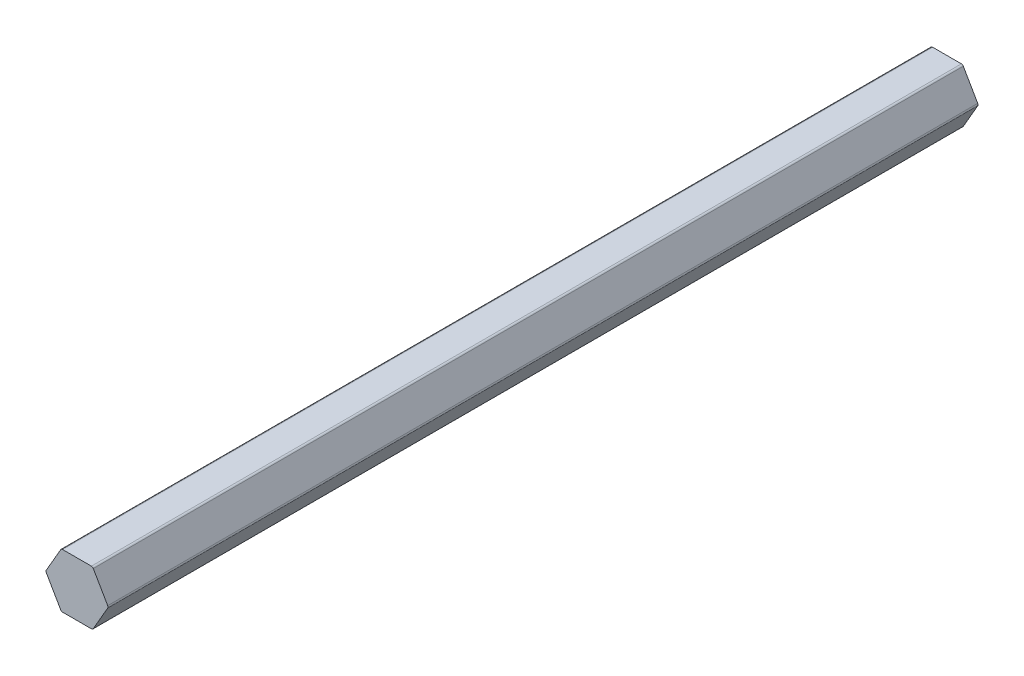
ISO-10303-21;
HEADER;
FILE_DESCRIPTION(('STEP AP214'),'2;1');
FILE_NAME('part.step','',(''),(''),'','','');
FILE_SCHEMA(('AUTOMOTIVE_DESIGN { 1 0 10303 214 1 1 1 1 }'));
ENDSEC;
DATA;
#1=APPLICATION_CONTEXT('core data for automotive mechanical design processes');
#2=APPLICATION_PROTOCOL_DEFINITION('international standard','automotive_design',2000,#1);
#3=PRODUCT_CONTEXT('',#1,'mechanical');
#4=PRODUCT('Part','Part','',(#3));
#5=PRODUCT_RELATED_PRODUCT_CATEGORY('part','',(#4));
#6=PRODUCT_DEFINITION_FORMATION('','',#4);
#7=PRODUCT_DEFINITION_CONTEXT('part definition',#1,'design');
#8=PRODUCT_DEFINITION('design','',#6,#7);
#9=PRODUCT_DEFINITION_SHAPE('','',#8);
#10=(LENGTH_UNIT() NAMED_UNIT(*) SI_UNIT(.MILLI.,.METRE.));
#11=(NAMED_UNIT(*) PLANE_ANGLE_UNIT() SI_UNIT($,.RADIAN.));
#12=(NAMED_UNIT(*) SI_UNIT($,.STERADIAN.) SOLID_ANGLE_UNIT());
#13=UNCERTAINTY_MEASURE_WITH_UNIT(LENGTH_MEASURE(1.E-05),#10,'distance_accuracy_value','');
#14=(GEOMETRIC_REPRESENTATION_CONTEXT(3) GLOBAL_UNCERTAINTY_ASSIGNED_CONTEXT((#13)) GLOBAL_UNIT_ASSIGNED_CONTEXT((#10,
#11,#12)) REPRESENTATION_CONTEXT('',''));
#15=CARTESIAN_POINT('',(0.,0.,0.));
#16=DIRECTION('',(0.,0.,1.));
#17=DIRECTION('',(1.,0.,0.));
#18=AXIS2_PLACEMENT_3D('',#15,#16,#17);
#19=CARTESIAN_POINT('',(-3.36554792418708,-5.8293,457.2));
#20=DIRECTION('',(0.,0.,-1.));
#21=DIRECTION('',(-1.,0.,0.));
#22=AXIS2_PLACEMENT_3D('',#19,#20,#21);
#23=CYLINDRICAL_SURFACE('',#22,0.508);
#24=CARTESIAN_POINT('',(-3.36554792418708,-5.8293,254.));
#25=DIRECTION('',(0.,0.,1.));
#26=DIRECTION('',(1.,0.,0.));
#27=AXIS2_PLACEMENT_3D('',#24,#25,#26);
#28=CIRCLE('',#27,0.508);
#29=CARTESIAN_POINT('',(-3.36554792418708,-6.3373,254.));
#30=VERTEX_POINT('',#29);
#31=CARTESIAN_POINT('',(-3.80548882930957,-6.0833,254.));
#32=VERTEX_POINT('',#31);
#33=EDGE_CURVE('E193',#30,#32,#28,.F.);
#34=ORIENTED_EDGE('',*,*,#33,.F.);
#35=DIRECTION('',(0.,0.,1.));
#36=VECTOR('',#35,1.);
#37=CARTESIAN_POINT('',(-3.36554792418708,-6.3373,457.2));
#38=LINE('',#37,#36);
#39=CARTESIAN_POINT('',(-3.36554792418708,-6.3373,457.2));
#40=VERTEX_POINT('',#39);
#41=EDGE_CURVE('E185',#30,#40,#38,.T.);
#42=ORIENTED_EDGE('',*,*,#41,.T.);
#43=CARTESIAN_POINT('',(-3.36554792418708,-5.8293,457.2));
#44=DIRECTION('',(0.,0.,-1.));
#45=DIRECTION('',(-1.,0.,0.));
#46=AXIS2_PLACEMENT_3D('',#43,#44,#45);
#47=CIRCLE('',#46,0.508);
#48=CARTESIAN_POINT('',(-3.80548882930957,-6.0833,457.2));
#49=VERTEX_POINT('',#48);
#50=EDGE_CURVE('E121',#40,#49,#47,.T.);
#51=ORIENTED_EDGE('',*,*,#50,.T.);
#52=DIRECTION('',(0.,0.,1.));
#53=VECTOR('',#52,1.);
#54=CARTESIAN_POINT('',(-3.80548882930957,-6.0833,457.2));
#55=LINE('',#54,#53);
#56=EDGE_CURVE('E188',#49,#32,#55,.F.);
#57=ORIENTED_EDGE('',*,*,#56,.T.);
#58=EDGE_LOOP('',(#34,#42,#51,#57));
#59=FACE_BOUND('',#58,.T.);
#60=ADVANCED_FACE('F34',(#59),#23,.T.);
#61=CARTESIAN_POINT('',(3.36554792418708,5.8293,457.2));
#62=DIRECTION('',(0.,0.,-1.));
#63=DIRECTION('',(-1.,0.,0.));
#64=AXIS2_PLACEMENT_3D('',#61,#62,#63);
#65=CYLINDRICAL_SURFACE('',#64,0.508);
#66=CARTESIAN_POINT('',(3.36554792418708,5.8293,254.));
#67=DIRECTION('',(0.,0.,1.));
#68=DIRECTION('',(1.,0.,0.));
#69=AXIS2_PLACEMENT_3D('',#66,#67,#68);
#70=CIRCLE('',#69,0.508);
#71=CARTESIAN_POINT('',(3.36554792418708,6.3373,254.));
#72=VERTEX_POINT('',#71);
#73=CARTESIAN_POINT('',(3.80548882930958,6.0833,254.));
#74=VERTEX_POINT('',#73);
#75=EDGE_CURVE('E244',#72,#74,#70,.F.);
#76=ORIENTED_EDGE('',*,*,#75,.F.);
#77=DIRECTION('',(0.,0.,1.));
#78=VECTOR('',#77,1.);
#79=CARTESIAN_POINT('',(3.36554792418708,6.3373,457.2));
#80=LINE('',#79,#78);
#81=CARTESIAN_POINT('',(3.36554792418708,6.3373,457.2));
#82=VERTEX_POINT('',#81);
#83=EDGE_CURVE('E178',#72,#82,#80,.T.);
#84=ORIENTED_EDGE('',*,*,#83,.T.);
#85=CARTESIAN_POINT('',(3.36554792418708,5.8293,457.2));
#86=DIRECTION('',(0.,0.,-1.));
#87=DIRECTION('',(-1.,0.,0.));
#88=AXIS2_PLACEMENT_3D('',#85,#86,#87);
#89=CIRCLE('',#88,0.508);
#90=CARTESIAN_POINT('',(3.80548882930958,6.0833,457.2));
#91=VERTEX_POINT('',#90);
#92=EDGE_CURVE('E145',#82,#91,#89,.T.);
#93=ORIENTED_EDGE('',*,*,#92,.T.);
#94=DIRECTION('',(0.,0.,1.));
#95=VECTOR('',#94,1.);
#96=CARTESIAN_POINT('',(3.80548882930958,6.0833,457.2));
#97=LINE('',#96,#95);
#98=EDGE_CURVE('E180',#91,#74,#97,.F.);
#99=ORIENTED_EDGE('',*,*,#98,.T.);
#100=EDGE_LOOP('',(#76,#84,#93,#99));
#101=FACE_BOUND('',#100,.T.);
#102=ADVANCED_FACE('F243',(#101),#65,.T.);
#103=CARTESIAN_POINT('',(-3.36554792418708,5.8293,457.2));
#104=DIRECTION('',(0.,0.,-1.));
#105=DIRECTION('',(-1.,0.,0.));
#106=AXIS2_PLACEMENT_3D('',#103,#104,#105);
#107=CYLINDRICAL_SURFACE('',#106,0.508);
#108=CARTESIAN_POINT('',(-3.36554792418708,5.8293,254.));
#109=DIRECTION('',(0.,0.,1.));
#110=DIRECTION('',(1.,0.,0.));
#111=AXIS2_PLACEMENT_3D('',#108,#109,#110);
#112=CIRCLE('',#111,0.508);
#113=CARTESIAN_POINT('',(-3.80548882930958,6.0833,254.));
#114=VERTEX_POINT('',#113);
#115=CARTESIAN_POINT('',(-3.36554792418708,6.3373,254.));
#116=VERTEX_POINT('',#115);
#117=EDGE_CURVE('E149',#114,#116,#112,.F.);
#118=ORIENTED_EDGE('',*,*,#117,.F.);
#119=DIRECTION('',(0.,0.,1.));
#120=VECTOR('',#119,1.);
#121=CARTESIAN_POINT('',(-3.80548882930958,6.0833,457.2));
#122=LINE('',#121,#120);
#123=CARTESIAN_POINT('',(-3.80548882930958,6.0833,457.2));
#124=VERTEX_POINT('',#123);
#125=EDGE_CURVE('E173',#114,#124,#122,.T.);
#126=ORIENTED_EDGE('',*,*,#125,.T.);
#127=CARTESIAN_POINT('',(-3.36554792418708,5.8293,457.2));
#128=DIRECTION('',(0.,0.,-1.));
#129=DIRECTION('',(-1.,0.,0.));
#130=AXIS2_PLACEMENT_3D('',#127,#128,#129);
#131=CIRCLE('',#130,0.508);
#132=CARTESIAN_POINT('',(-3.36554792418708,6.3373,457.2));
#133=VERTEX_POINT('',#132);
#134=EDGE_CURVE('E143',#124,#133,#131,.T.);
#135=ORIENTED_EDGE('',*,*,#134,.T.);
#136=DIRECTION('',(0.,0.,1.));
#137=VECTOR('',#136,1.);
#138=CARTESIAN_POINT('',(-3.36554792418708,6.3373,457.2));
#139=LINE('',#138,#137);
#140=EDGE_CURVE('E176',#133,#116,#139,.F.);
#141=ORIENTED_EDGE('',*,*,#140,.T.);
#142=EDGE_LOOP('',(#118,#126,#135,#141));
#143=FACE_BOUND('',#142,.T.);
#144=ADVANCED_FACE('F208',(#143),#107,.T.);
#145=CARTESIAN_POINT('',(-6.73109584837417,0.,457.2));
#146=DIRECTION('',(0.,0.,-1.));
#147=DIRECTION('',(-1.,0.,0.));
#148=AXIS2_PLACEMENT_3D('',#145,#146,#147);
#149=CYLINDRICAL_SURFACE('',#148,0.508);
#150=CARTESIAN_POINT('',(-6.73109584837417,0.,254.));
#151=DIRECTION('',(0.,0.,1.));
#152=DIRECTION('',(1.,0.,0.));
#153=AXIS2_PLACEMENT_3D('',#150,#151,#152);
#154=CIRCLE('',#153,0.508);
#155=CARTESIAN_POINT('',(-7.17103675349666,-0.254000000000004,254.));
#156=VERTEX_POINT('',#155);
#157=CARTESIAN_POINT('',(-7.17103675349666,0.253999999999995,254.));
#158=VERTEX_POINT('',#157);
#159=EDGE_CURVE('E155',#156,#158,#154,.F.);
#160=ORIENTED_EDGE('',*,*,#159,.F.);
#161=DIRECTION('',(0.,0.,1.));
#162=VECTOR('',#161,1.);
#163=CARTESIAN_POINT('',(-7.17103675349666,-0.254000000000004,457.2));
#164=LINE('',#163,#162);
#165=CARTESIAN_POINT('',(-7.17103675349666,-0.254000000000004,457.2));
#166=VERTEX_POINT('',#165);
#167=EDGE_CURVE('E91',#156,#166,#164,.T.);
#168=ORIENTED_EDGE('',*,*,#167,.T.);
#169=CARTESIAN_POINT('',(-6.73109584837417,0.,457.2));
#170=DIRECTION('',(0.,0.,-1.));
#171=DIRECTION('',(-1.,0.,0.));
#172=AXIS2_PLACEMENT_3D('',#169,#170,#171);
#173=CIRCLE('',#172,0.508);
#174=CARTESIAN_POINT('',(-7.17103675349666,0.253999999999996,457.2));
#175=VERTEX_POINT('',#174);
#176=EDGE_CURVE('E141',#166,#175,#173,.T.);
#177=ORIENTED_EDGE('',*,*,#176,.T.);
#178=DIRECTION('',(0.,0.,1.));
#179=VECTOR('',#178,1.);
#180=CARTESIAN_POINT('',(-7.17103675349666,0.253999999999996,457.2));
#181=LINE('',#180,#179);
#182=EDGE_CURVE('E175',#175,#158,#181,.F.);
#183=ORIENTED_EDGE('',*,*,#182,.T.);
#184=EDGE_LOOP('',(#160,#168,#177,#183));
#185=FACE_BOUND('',#184,.T.);
#186=ADVANCED_FACE('F205',(#185),#149,.T.);
#187=CARTESIAN_POINT('',(-7.31768372187083,0.,457.2));
#188=DIRECTION('',(0.866025403784438,0.5,0.));
#189=DIRECTION('',(-0.5,0.866025403784438,0.));
#190=AXIS2_PLACEMENT_3D('',#187,#188,#189);
#191=PLANE('',#190);
#192=ORIENTED_EDGE('',*,*,#167,.F.);
#193=DIRECTION('',(0.5,-0.866025403784438,0.));
#194=VECTOR('',#193,1.);
#195=CARTESIAN_POINT('',(-7.31768372187083,0.,254.));
#196=LINE('',#195,#194);
#197=EDGE_CURVE('E202',#156,#32,#196,.T.);
#198=ORIENTED_EDGE('',*,*,#197,.T.);
#199=ORIENTED_EDGE('',*,*,#56,.F.);
#200=DIRECTION('',(0.500000000000001,-0.866025403784438,0.));
#201=VECTOR('',#200,1.);
#202=CARTESIAN_POINT('',(-7.17103675349666,-0.254000000000004,457.2));
#203=LINE('',#202,#201);
#204=EDGE_CURVE('E124',#166,#49,#203,.T.);
#205=ORIENTED_EDGE('',*,*,#204,.F.);
#206=EDGE_LOOP('',(#192,#198,#199,#205));
#207=FACE_BOUND('',#206,.T.);
#208=ADVANCED_FACE('F200',(#207),#191,.F.);
#209=CARTESIAN_POINT('',(-3.65884186093541,-6.3373,457.2));
#210=DIRECTION('',(0.,1.,0.));
#211=DIRECTION('',(-1.,0.,0.));
#212=AXIS2_PLACEMENT_3D('',#209,#210,#211);
#213=PLANE('',#212);
#214=ORIENTED_EDGE('',*,*,#41,.F.);
#215=DIRECTION('',(1.,0.,0.));
#216=VECTOR('',#215,1.);
#217=CARTESIAN_POINT('',(-3.65884186093541,-6.3373,254.));
#218=LINE('',#217,#216);
#219=CARTESIAN_POINT('',(3.36554792418708,-6.3373,254.));
#220=VERTEX_POINT('',#219);
#221=EDGE_CURVE('E132',#30,#220,#218,.T.);
#222=ORIENTED_EDGE('',*,*,#221,.T.);
#223=DIRECTION('',(0.,0.,-1.));
#224=VECTOR('',#223,1.);
#225=CARTESIAN_POINT('',(3.36554792418708,-6.3373,457.2));
#226=LINE('',#225,#224);
#227=CARTESIAN_POINT('',(3.36554792418708,-6.3373,457.2));
#228=VERTEX_POINT('',#227);
#229=EDGE_CURVE('E128',#228,#220,#226,.T.);
#230=ORIENTED_EDGE('',*,*,#229,.F.);
#231=DIRECTION('',(1.,0.,0.));
#232=VECTOR('',#231,1.);
#233=CARTESIAN_POINT('',(7.31768372187083,-6.3373,457.2));
#234=LINE('',#233,#232);
#235=EDGE_CURVE('E114',#40,#228,#234,.T.);
#236=ORIENTED_EDGE('',*,*,#235,.F.);
#237=EDGE_LOOP('',(#214,#222,#230,#236));
#238=FACE_BOUND('',#237,.T.);
#239=ADVANCED_FACE('F129',(#238),#213,.F.);
#240=CARTESIAN_POINT('',(7.31768372187083,0.,457.2));
#241=DIRECTION('',(-0.866025403784439,-0.5,0.));
#242=DIRECTION('',(0.5,-0.866025403784439,0.));
#243=AXIS2_PLACEMENT_3D('',#240,#241,#242);
#244=PLANE('',#243);
#245=DIRECTION('',(0.,0.,-1.));
#246=VECTOR('',#245,1.);
#247=CARTESIAN_POINT('',(7.17103675349666,0.254000000000004,457.2));
#248=LINE('',#247,#246);
#249=CARTESIAN_POINT('',(7.17103675349666,0.254000000000003,254.));
#250=VERTEX_POINT('',#249);
#251=CARTESIAN_POINT('',(7.17103675349666,0.254000000000003,457.2));
#252=VERTEX_POINT('',#251);
#253=EDGE_CURVE('E108',#250,#252,#248,.F.);
#254=ORIENTED_EDGE('',*,*,#253,.F.);
#255=DIRECTION('',(-0.5,0.866025403784439,0.));
#256=VECTOR('',#255,1.);
#257=CARTESIAN_POINT('',(7.31768372187083,0.,254.));
#258=LINE('',#257,#256);
#259=EDGE_CURVE('E240',#250,#74,#258,.T.);
#260=ORIENTED_EDGE('',*,*,#259,.T.);
#261=ORIENTED_EDGE('',*,*,#98,.F.);
#262=DIRECTION('',(-0.5,0.866025403784438,0.));
#263=VECTOR('',#262,1.);
#264=CARTESIAN_POINT('',(7.17103675349666,0.254000000000003,457.2));
#265=LINE('',#264,#263);
#266=EDGE_CURVE('E137',#252,#91,#265,.T.);
#267=ORIENTED_EDGE('',*,*,#266,.F.);
#268=EDGE_LOOP('',(#254,#260,#261,#267));
#269=FACE_BOUND('',#268,.T.);
#270=ADVANCED_FACE('F238',(#269),#244,.F.);
#271=CARTESIAN_POINT('',(3.65884186093541,6.3373,457.2));
#272=DIRECTION('',(0.,-1.,0.));
#273=DIRECTION('',(1.,0.,0.));
#274=AXIS2_PLACEMENT_3D('',#271,#272,#273);
#275=PLANE('',#274);
#276=ORIENTED_EDGE('',*,*,#83,.F.);
#277=DIRECTION('',(-1.,0.,0.));
#278=VECTOR('',#277,1.);
#279=CARTESIAN_POINT('',(3.65884186093541,6.3373,254.));
#280=LINE('',#279,#278);
#281=EDGE_CURVE('E217',#72,#116,#280,.T.);
#282=ORIENTED_EDGE('',*,*,#281,.T.);
#283=ORIENTED_EDGE('',*,*,#140,.F.);
#284=DIRECTION('',(1.,0.,0.));
#285=VECTOR('',#284,1.);
#286=CARTESIAN_POINT('',(7.31768372187083,6.3373,457.2));
#287=LINE('',#286,#285);
#288=EDGE_CURVE('E163',#82,#133,#287,.F.);
#289=ORIENTED_EDGE('',*,*,#288,.F.);
#290=EDGE_LOOP('',(#276,#282,#283,#289));
#291=FACE_BOUND('',#290,.T.);
#292=ADVANCED_FACE('F214',(#291),#275,.F.);
#293=CARTESIAN_POINT('',(-3.65884186093541,6.3373,457.2));
#294=DIRECTION('',(0.866025403784439,-0.5,0.));
#295=DIRECTION('',(0.5,0.866025403784439,0.));
#296=AXIS2_PLACEMENT_3D('',#293,#294,#295);
#297=PLANE('',#296);
#298=ORIENTED_EDGE('',*,*,#125,.F.);
#299=DIRECTION('',(-0.5,-0.866025403784439,0.));
#300=VECTOR('',#299,1.);
#301=CARTESIAN_POINT('',(-3.65884186093541,6.3373,254.));
#302=LINE('',#301,#300);
#303=EDGE_CURVE('E99',#114,#158,#302,.T.);
#304=ORIENTED_EDGE('',*,*,#303,.T.);
#305=ORIENTED_EDGE('',*,*,#182,.F.);
#306=DIRECTION('',(-0.5,-0.866025403784439,0.));
#307=VECTOR('',#306,1.);
#308=CARTESIAN_POINT('',(-3.80548882930958,6.0833,457.2));
#309=LINE('',#308,#307);
#310=EDGE_CURVE('E159',#124,#175,#309,.T.);
#311=ORIENTED_EDGE('',*,*,#310,.F.);
#312=EDGE_LOOP('',(#298,#304,#305,#311));
#313=FACE_BOUND('',#312,.T.);
#314=ADVANCED_FACE('F206',(#313),#297,.F.);
#315=CARTESIAN_POINT('',(6.73109584837417,0.,457.2));
#316=DIRECTION('',(0.,0.,-1.));
#317=DIRECTION('',(-1.,0.,0.));
#318=AXIS2_PLACEMENT_3D('',#315,#316,#317);
#319=CYLINDRICAL_SURFACE('',#318,0.508);
#320=CARTESIAN_POINT('',(6.73109584837417,0.,254.));
#321=DIRECTION('',(0.,0.,1.));
#322=DIRECTION('',(1.,0.,0.));
#323=AXIS2_PLACEMENT_3D('',#320,#321,#322);
#324=CIRCLE('',#323,0.508);
#325=CARTESIAN_POINT('',(7.17103675349666,-0.253999999999996,254.));
#326=VERTEX_POINT('',#325);
#327=EDGE_CURVE('E48',#250,#326,#324,.F.);
#328=ORIENTED_EDGE('',*,*,#327,.F.);
#329=ORIENTED_EDGE('',*,*,#253,.T.);
#330=CARTESIAN_POINT('',(6.73109584837417,0.,457.2));
#331=DIRECTION('',(0.,0.,-1.));
#332=DIRECTION('',(-1.,0.,0.));
#333=AXIS2_PLACEMENT_3D('',#330,#331,#332);
#334=CIRCLE('',#333,0.508);
#335=CARTESIAN_POINT('',(7.17103675349667,-0.253999999999996,457.2));
#336=VERTEX_POINT('',#335);
#337=EDGE_CURVE('E135',#336,#252,#334,.F.);
#338=ORIENTED_EDGE('',*,*,#337,.F.);
#339=DIRECTION('',(0.,0.,1.));
#340=VECTOR('',#339,1.);
#341=CARTESIAN_POINT('',(7.17103675349666,-0.253999999999996,457.2));
#342=LINE('',#341,#340);
#343=EDGE_CURVE('E162',#336,#326,#342,.F.);
#344=ORIENTED_EDGE('',*,*,#343,.T.);
#345=EDGE_LOOP('',(#328,#329,#338,#344));
#346=FACE_BOUND('',#345,.T.);
#347=ADVANCED_FACE('F252',(#346),#319,.T.);
#348=CARTESIAN_POINT('',(3.36554792418709,-5.8293,457.2));
#349=DIRECTION('',(0.,0.,-1.));
#350=DIRECTION('',(-1.,0.,0.));
#351=AXIS2_PLACEMENT_3D('',#348,#349,#350);
#352=CYLINDRICAL_SURFACE('',#351,0.508);
#353=CARTESIAN_POINT('',(3.36554792418709,-5.8293,254.));
#354=DIRECTION('',(0.,0.,1.));
#355=DIRECTION('',(1.,0.,0.));
#356=AXIS2_PLACEMENT_3D('',#353,#354,#355);
#357=CIRCLE('',#356,0.508);
#358=CARTESIAN_POINT('',(3.80548882930958,-6.0833,254.));
#359=VERTEX_POINT('',#358);
#360=EDGE_CURVE('E231',#359,#220,#357,.F.);
#361=ORIENTED_EDGE('',*,*,#360,.F.);
#362=DIRECTION('',(0.,0.,1.));
#363=VECTOR('',#362,1.);
#364=CARTESIAN_POINT('',(3.80548882930958,-6.0833,457.2));
#365=LINE('',#364,#363);
#366=CARTESIAN_POINT('',(3.80548882930958,-6.0833,457.2));
#367=VERTEX_POINT('',#366);
#368=EDGE_CURVE('E56',#359,#367,#365,.T.);
#369=ORIENTED_EDGE('',*,*,#368,.T.);
#370=CARTESIAN_POINT('',(3.36554792418709,-5.8293,457.2));
#371=DIRECTION('',(0.,0.,-1.));
#372=DIRECTION('',(-1.,0.,0.));
#373=AXIS2_PLACEMENT_3D('',#370,#371,#372);
#374=CIRCLE('',#373,0.508);
#375=EDGE_CURVE('E118',#228,#367,#374,.F.);
#376=ORIENTED_EDGE('',*,*,#375,.F.);
#377=ORIENTED_EDGE('',*,*,#229,.T.);
#378=EDGE_LOOP('',(#361,#369,#376,#377));
#379=FACE_BOUND('',#378,.T.);
#380=ADVANCED_FACE('F134',(#379),#352,.T.);
#381=CARTESIAN_POINT('',(7.31768372187083,0.,457.2));
#382=DIRECTION('',(0.,0.,1.));
#383=DIRECTION('',(1.,0.,0.));
#384=AXIS2_PLACEMENT_3D('',#381,#382,#383);
#385=PLANE('',#384);
#386=ORIENTED_EDGE('',*,*,#176,.F.);
#387=ORIENTED_EDGE('',*,*,#204,.T.);
#388=ORIENTED_EDGE('',*,*,#50,.F.);
#389=ORIENTED_EDGE('',*,*,#235,.T.);
#390=ORIENTED_EDGE('',*,*,#375,.T.);
#391=DIRECTION('',(-0.5,-0.866025403784439,0.));
#392=VECTOR('',#391,1.);
#393=CARTESIAN_POINT('',(3.65884186093542,-6.3373,457.2));
#394=LINE('',#393,#392);
#395=EDGE_CURVE('E41',#367,#336,#394,.F.);
#396=ORIENTED_EDGE('',*,*,#395,.T.);
#397=ORIENTED_EDGE('',*,*,#337,.T.);
#398=ORIENTED_EDGE('',*,*,#266,.T.);
#399=ORIENTED_EDGE('',*,*,#92,.F.);
#400=ORIENTED_EDGE('',*,*,#288,.T.);
#401=ORIENTED_EDGE('',*,*,#134,.F.);
#402=ORIENTED_EDGE('',*,*,#310,.T.);
#403=EDGE_LOOP('',(#386,#387,#388,#389,#390,#396,#397,#398,#399,#400,#401,#402));
#404=FACE_BOUND('',#403,.T.);
#405=ADVANCED_FACE('F116',(#404),#385,.T.);
#406=CARTESIAN_POINT('',(3.65884186093542,-6.3373,457.2));
#407=DIRECTION('',(-0.866025403784439,0.5,0.));
#408=DIRECTION('',(-0.5,-0.866025403784439,0.));
#409=AXIS2_PLACEMENT_3D('',#406,#407,#408);
#410=PLANE('',#409);
#411=ORIENTED_EDGE('',*,*,#368,.F.);
#412=DIRECTION('',(0.5,0.866025403784439,0.));
#413=VECTOR('',#412,1.);
#414=CARTESIAN_POINT('',(3.65884186093542,-6.3373,254.));
#415=LINE('',#414,#413);
#416=EDGE_CURVE('E11',#359,#326,#415,.T.);
#417=ORIENTED_EDGE('',*,*,#416,.T.);
#418=ORIENTED_EDGE('',*,*,#343,.F.);
#419=ORIENTED_EDGE('',*,*,#395,.F.);
#420=EDGE_LOOP('',(#411,#417,#418,#419));
#421=FACE_BOUND('',#420,.T.);
#422=ADVANCED_FACE('F234',(#421),#410,.F.);
#423=CARTESIAN_POINT('',(0.,0.,254.));
#424=DIRECTION('',(0.,0.,1.));
#425=DIRECTION('',(1.,0.,0.));
#426=AXIS2_PLACEMENT_3D('',#423,#424,#425);
#427=PLANE('',#426);
#428=ORIENTED_EDGE('',*,*,#117,.T.);
#429=ORIENTED_EDGE('',*,*,#281,.F.);
#430=ORIENTED_EDGE('',*,*,#75,.T.);
#431=ORIENTED_EDGE('',*,*,#259,.F.);
#432=ORIENTED_EDGE('',*,*,#327,.T.);
#433=ORIENTED_EDGE('',*,*,#416,.F.);
#434=ORIENTED_EDGE('',*,*,#360,.T.);
#435=ORIENTED_EDGE('',*,*,#221,.F.);
#436=ORIENTED_EDGE('',*,*,#33,.T.);
#437=ORIENTED_EDGE('',*,*,#197,.F.);
#438=ORIENTED_EDGE('',*,*,#159,.T.);
#439=ORIENTED_EDGE('',*,*,#303,.F.);
#440=EDGE_LOOP('',(#428,#429,#430,#431,#432,#433,#434,#435,#436,#437,#438,#439));
#441=FACE_BOUND('',#440,.T.);
#442=ADVANCED_FACE('F230',(#441),#427,.F.);
#443=CLOSED_SHELL('',(#60,#102,#144,#186,#208,#239,#270,#292,#314,#347,#380,#405,#422,#442));
#444=MANIFOLD_SOLID_BREP('B2',#443);
#445=ADVANCED_BREP_SHAPE_REPRESENTATION('',(#18,#444),#14);
#446=SHAPE_DEFINITION_REPRESENTATION(#9,#445);
ENDSEC;
END-ISO-10303-21;
